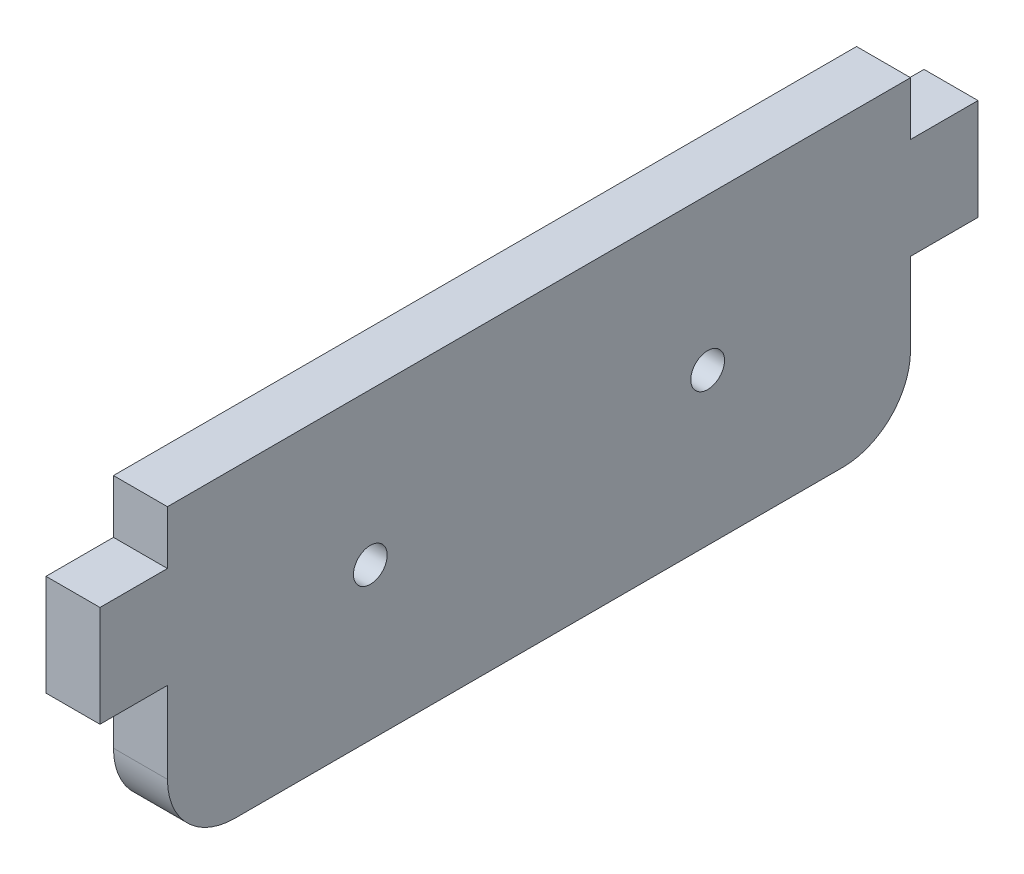
ISO-10303-21;
HEADER;
FILE_DESCRIPTION(('STEP AP214'),'2;1');
FILE_NAME('part.step','',(''),(''),'','','');
FILE_SCHEMA(('AUTOMOTIVE_DESIGN { 1 0 10303 214 1 1 1 1 }'));
ENDSEC;
DATA;
#1=APPLICATION_CONTEXT('core data for automotive mechanical design processes');
#2=APPLICATION_PROTOCOL_DEFINITION('international standard','automotive_design',2000,#1);
#3=PRODUCT_CONTEXT('',#1,'mechanical');
#4=PRODUCT('Part','Part','',(#3));
#5=PRODUCT_RELATED_PRODUCT_CATEGORY('part','',(#4));
#6=PRODUCT_DEFINITION_FORMATION('','',#4);
#7=PRODUCT_DEFINITION_CONTEXT('part definition',#1,'design');
#8=PRODUCT_DEFINITION('design','',#6,#7);
#9=PRODUCT_DEFINITION_SHAPE('','',#8);
#10=(LENGTH_UNIT() NAMED_UNIT(*) SI_UNIT(.MILLI.,.METRE.));
#11=(NAMED_UNIT(*) PLANE_ANGLE_UNIT() SI_UNIT($,.RADIAN.));
#12=(NAMED_UNIT(*) SI_UNIT($,.STERADIAN.) SOLID_ANGLE_UNIT());
#13=UNCERTAINTY_MEASURE_WITH_UNIT(LENGTH_MEASURE(1.E-05),#10,'distance_accuracy_value','');
#14=(GEOMETRIC_REPRESENTATION_CONTEXT(3) GLOBAL_UNCERTAINTY_ASSIGNED_CONTEXT((#13)) GLOBAL_UNIT_ASSIGNED_CONTEXT((#10,
#11,#12)) REPRESENTATION_CONTEXT('',''));
#15=CARTESIAN_POINT('',(0.,0.,0.));
#16=DIRECTION('',(0.,0.,1.));
#17=DIRECTION('',(1.,0.,0.));
#18=AXIS2_PLACEMENT_3D('',#15,#16,#17);
#19=CARTESIAN_POINT('',(-55.0000000000805,-1.82088380911604E-10,-120.14));
#20=DIRECTION('',(0.,0.,1.));
#21=DIRECTION('',(1.,0.,0.));
#22=AXIS2_PLACEMENT_3D('',#19,#20,#21);
#23=PLANE('',#22);
#24=DIRECTION('',(-1.,0.,0.));
#25=VECTOR('',#24,1.);
#26=CARTESIAN_POINT('',(-59.0000000000146,-70.5000000000152,-120.14));
#27=LINE('',#26,#25);
#28=CARTESIAN_POINT('',(-51.0000000000146,-70.5000000000152,-120.14));
#29=VERTEX_POINT('',#28);
#30=CARTESIAN_POINT('',(-59.0000000000146,-70.5000000000152,-120.14));
#31=VERTEX_POINT('',#30);
#32=EDGE_CURVE('E54',#29,#31,#27,.T.);
#33=ORIENTED_EDGE('',*,*,#32,.T.);
#34=DIRECTION('',(0.,-1.,0.));
#35=VECTOR('',#34,1.);
#36=CARTESIAN_POINT('',(-59.0000000000146,-62.5655810765651,-120.14));
#37=LINE('',#36,#35);
#38=CARTESIAN_POINT('',(-59.0000000000146,-62.5655810765651,-120.14));
#39=VERTEX_POINT('',#38);
#40=EDGE_CURVE('E146',#39,#31,#37,.T.);
#41=ORIENTED_EDGE('',*,*,#40,.F.);
#42=DIRECTION('',(-1.,0.,0.));
#43=VECTOR('',#42,1.);
#44=CARTESIAN_POINT('',(-51.0000000000146,-62.5655810765651,-120.14));
#45=LINE('',#44,#43);
#46=CARTESIAN_POINT('',(-51.0000000000146,-62.5655810765651,-120.14));
#47=VERTEX_POINT('',#46);
#48=EDGE_CURVE('E147',#47,#39,#45,.T.);
#49=ORIENTED_EDGE('',*,*,#48,.F.);
#50=DIRECTION('',(0.,1.,0.));
#51=VECTOR('',#50,1.);
#52=CARTESIAN_POINT('',(-51.0000000000146,-92.5655810765651,-120.14));
#53=LINE('',#52,#51);
#54=EDGE_CURVE('E59',#29,#47,#53,.T.);
#55=ORIENTED_EDGE('',*,*,#54,.F.);
#56=EDGE_LOOP('',(#33,#41,#49,#55));
#57=FACE_BOUND('',#56,.T.);
#58=ADVANCED_FACE('F37',(#57),#23,.F.);
#59=DIRECTION('',(1.,0.,0.));
#60=VECTOR('',#59,1.);
#61=CARTESIAN_POINT('',(-59.0000000000146,-85.5000000000152,-120.14));
#62=LINE('',#61,#60);
#63=CARTESIAN_POINT('',(-59.0000000000146,-85.5000000000152,-120.14));
#64=VERTEX_POINT('',#63);
#65=CARTESIAN_POINT('',(-51.0000000000146,-85.5000000000152,-120.14));
#66=VERTEX_POINT('',#65);
#67=EDGE_CURVE('E141',#64,#66,#62,.T.);
#68=ORIENTED_EDGE('',*,*,#67,.T.);
#69=CARTESIAN_POINT('',(-51.0000000000146,-97.5655810765651,-120.14));
#70=VERTEX_POINT('',#69);
#71=EDGE_CURVE('E184',#70,#66,#53,.T.);
#72=ORIENTED_EDGE('',*,*,#71,.F.);
#73=DIRECTION('',(1.,0.,0.));
#74=VECTOR('',#73,1.);
#75=CARTESIAN_POINT('',(-55.0000000000805,-97.5655810765651,-120.14));
#76=LINE('',#75,#74);
#77=CARTESIAN_POINT('',(-59.0000000000146,-97.5655810765651,-120.14));
#78=VERTEX_POINT('',#77);
#79=EDGE_CURVE('E11',#70,#78,#76,.F.);
#80=ORIENTED_EDGE('',*,*,#79,.T.);
#81=EDGE_CURVE('E136',#64,#78,#37,.T.);
#82=ORIENTED_EDGE('',*,*,#81,.F.);
#83=EDGE_LOOP('',(#68,#72,#80,#82));
#84=FACE_BOUND('',#83,.T.);
#85=ADVANCED_FACE('F138',(#84),#23,.F.);
#86=CARTESIAN_POINT('',(-51.0000000000146,-70.5000000000152,-10.));
#87=DIRECTION('',(1.,0.,0.));
#88=DIRECTION('',(0.,0.,-1.));
#89=AXIS2_PLACEMENT_3D('',#86,#87,#88);
#90=PLANE('',#89);
#91=CARTESIAN_POINT('',(-51.0000000000146,-85.0655810765651,-40.07));
#92=DIRECTION('',(1.,0.,0.));
#93=DIRECTION('',(0.,0.,-1.));
#94=AXIS2_PLACEMENT_3D('',#91,#92,#93);
#95=CIRCLE('',#94,2.5);
#96=CARTESIAN_POINT('',(-51.0000000000146,-85.0655810765651,-42.57));
#97=VERTEX_POINT('',#96);
#98=EDGE_CURVE('E249',#97,#97,#95,.T.);
#99=ORIENTED_EDGE('',*,*,#98,.F.);
#100=EDGE_LOOP('',(#99));
#101=FACE_BOUND('',#100,.T.);
#102=CARTESIAN_POINT('',(-51.0000000000146,-85.0655810765651,-90.07));
#103=DIRECTION('',(1.,0.,0.));
#104=DIRECTION('',(0.,0.,1.));
#105=AXIS2_PLACEMENT_3D('',#102,#103,#104);
#106=CIRCLE('',#105,2.5);
#107=CARTESIAN_POINT('',(-51.0000000000146,-85.0655810765651,-87.57));
#108=VERTEX_POINT('',#107);
#109=EDGE_CURVE('E169',#108,#108,#106,.T.);
#110=ORIENTED_EDGE('',*,*,#109,.F.);
#111=EDGE_LOOP('',(#110));
#112=FACE_BOUND('',#111,.T.);
#113=DIRECTION('',(0.,-1.,0.));
#114=VECTOR('',#113,1.);
#115=CARTESIAN_POINT('',(-51.0000000000146,-92.5655810765651,-10.));
#116=LINE('',#115,#114);
#117=CARTESIAN_POINT('',(-51.0000000000146,-85.5000000000152,-10.));
#118=VERTEX_POINT('',#117);
#119=CARTESIAN_POINT('',(-51.0000000000146,-97.5655810765651,-10.));
#120=VERTEX_POINT('',#119);
#121=EDGE_CURVE('E194',#118,#120,#116,.T.);
#122=ORIENTED_EDGE('',*,*,#121,.T.);
#123=CARTESIAN_POINT('',(-51.0000000000146,-97.5655810765651,-20.));
#124=DIRECTION('',(1.,0.,0.));
#125=DIRECTION('',(0.,0.,-1.));
#126=AXIS2_PLACEMENT_3D('',#123,#124,#125);
#127=CIRCLE('',#126,10.);
#128=CARTESIAN_POINT('',(-51.0000000000146,-107.565581076565,-20.));
#129=VERTEX_POINT('',#128);
#130=EDGE_CURVE('E46',#120,#129,#127,.T.);
#131=ORIENTED_EDGE('',*,*,#130,.T.);
#132=DIRECTION('',(0.,0.,1.));
#133=VECTOR('',#132,1.);
#134=CARTESIAN_POINT('',(-51.0000000000146,-107.565581076565,-165.845579528106));
#135=LINE('',#134,#133);
#136=CARTESIAN_POINT('',(-51.0000000000146,-107.565581076565,-110.14));
#137=VERTEX_POINT('',#136);
#138=EDGE_CURVE('E200',#137,#129,#135,.T.);
#139=ORIENTED_EDGE('',*,*,#138,.F.);
#140=CARTESIAN_POINT('',(-51.0000000000146,-97.5655810765651,-110.14));
#141=DIRECTION('',(1.,0.,0.));
#142=DIRECTION('',(0.,0.,-1.));
#143=AXIS2_PLACEMENT_3D('',#140,#141,#142);
#144=CIRCLE('',#143,10.);
#145=EDGE_CURVE('E245',#137,#70,#144,.T.);
#146=ORIENTED_EDGE('',*,*,#145,.T.);
#147=ORIENTED_EDGE('',*,*,#71,.T.);
#148=DIRECTION('',(0.,0.,-1.));
#149=VECTOR('',#148,1.);
#150=CARTESIAN_POINT('',(-51.0000000000146,-85.5000000000152,-120.14));
#151=LINE('',#150,#149);
#152=CARTESIAN_POINT('',(-51.0000000000146,-85.5000000000152,-130.14));
#153=VERTEX_POINT('',#152);
#154=EDGE_CURVE('E159',#66,#153,#151,.T.);
#155=ORIENTED_EDGE('',*,*,#154,.T.);
#156=DIRECTION('',(0.,1.,0.));
#157=VECTOR('',#156,1.);
#158=CARTESIAN_POINT('',(-51.0000000000146,-70.5000000000152,-130.14));
#159=LINE('',#158,#157);
#160=CARTESIAN_POINT('',(-51.0000000000146,-70.5000000000152,-130.14));
#161=VERTEX_POINT('',#160);
#162=EDGE_CURVE('E172',#153,#161,#159,.T.);
#163=ORIENTED_EDGE('',*,*,#162,.T.);
#164=DIRECTION('',(0.,0.,-1.));
#165=VECTOR('',#164,1.);
#166=CARTESIAN_POINT('',(-51.0000000000146,-70.5000000000152,-120.14));
#167=LINE('',#166,#165);
#168=EDGE_CURVE('E178',#29,#161,#167,.T.);
#169=ORIENTED_EDGE('',*,*,#168,.F.);
#170=ORIENTED_EDGE('',*,*,#54,.T.);
#171=DIRECTION('',(0.,0.,1.));
#172=VECTOR('',#171,1.);
#173=CARTESIAN_POINT('',(-51.0000000000146,-62.5655810765651,-165.845579528106));
#174=LINE('',#173,#172);
#175=CARTESIAN_POINT('',(-51.0000000000146,-62.5655810765651,-10.));
#176=VERTEX_POINT('',#175);
#177=EDGE_CURVE('E203',#47,#176,#174,.T.);
#178=ORIENTED_EDGE('',*,*,#177,.T.);
#179=CARTESIAN_POINT('',(-51.0000000000146,-70.5000000000152,-10.));
#180=VERTEX_POINT('',#179);
#181=EDGE_CURVE('E195',#176,#180,#116,.T.);
#182=ORIENTED_EDGE('',*,*,#181,.T.);
#183=DIRECTION('',(0.,0.,1.));
#184=VECTOR('',#183,1.);
#185=CARTESIAN_POINT('',(-51.0000000000146,-70.5000000000152,-10.));
#186=LINE('',#185,#184);
#187=CARTESIAN_POINT('',(-51.0000000000146,-70.5000000000152,0.));
#188=VERTEX_POINT('',#187);
#189=EDGE_CURVE('E215',#180,#188,#186,.T.);
#190=ORIENTED_EDGE('',*,*,#189,.T.);
#191=DIRECTION('',(0.,1.,0.));
#192=VECTOR('',#191,1.);
#193=CARTESIAN_POINT('',(-51.0000000000146,-70.5000000000152,0.));
#194=LINE('',#193,#192);
#195=CARTESIAN_POINT('',(-51.0000000000146,-85.5000000000152,0.));
#196=VERTEX_POINT('',#195);
#197=EDGE_CURVE('E188',#196,#188,#194,.T.);
#198=ORIENTED_EDGE('',*,*,#197,.F.);
#199=DIRECTION('',(0.,0.,1.));
#200=VECTOR('',#199,1.);
#201=CARTESIAN_POINT('',(-51.0000000000146,-85.5000000000152,-10.));
#202=LINE('',#201,#200);
#203=EDGE_CURVE('E226',#118,#196,#202,.T.);
#204=ORIENTED_EDGE('',*,*,#203,.F.);
#205=EDGE_LOOP('',(#122,#131,#139,#146,#147,#155,#163,#169,#170,#178,#182,#190,#198,#204));
#206=FACE_BOUND('',#205,.T.);
#207=ADVANCED_FACE('F261',(#101,#112,#206),#90,.T.);
#208=CARTESIAN_POINT('',(-59.0000000000146,-85.5000000000152,-10.));
#209=DIRECTION('',(0.,-1.,0.));
#210=DIRECTION('',(0.,0.,-1.));
#211=AXIS2_PLACEMENT_3D('',#208,#209,#210);
#212=PLANE('',#211);
#213=DIRECTION('',(1.,0.,0.));
#214=VECTOR('',#213,1.);
#215=CARTESIAN_POINT('',(-59.0000000000146,-85.5000000000152,0.));
#216=LINE('',#215,#214);
#217=CARTESIAN_POINT('',(-59.0000000000146,-85.5000000000152,0.));
#218=VERTEX_POINT('',#217);
#219=EDGE_CURVE('E212',#218,#196,#216,.T.);
#220=ORIENTED_EDGE('',*,*,#219,.F.);
#221=DIRECTION('',(0.,0.,1.));
#222=VECTOR('',#221,1.);
#223=CARTESIAN_POINT('',(-59.0000000000146,-85.5000000000152,-10.));
#224=LINE('',#223,#222);
#225=CARTESIAN_POINT('',(-59.0000000000146,-85.5000000000152,-10.));
#226=VERTEX_POINT('',#225);
#227=EDGE_CURVE('E229',#226,#218,#224,.T.);
#228=ORIENTED_EDGE('',*,*,#227,.F.);
#229=DIRECTION('',(1.,0.,0.));
#230=VECTOR('',#229,1.);
#231=CARTESIAN_POINT('',(-59.0000000000146,-85.5000000000152,-10.));
#232=LINE('',#231,#230);
#233=EDGE_CURVE('E211',#226,#118,#232,.T.);
#234=ORIENTED_EDGE('',*,*,#233,.T.);
#235=ORIENTED_EDGE('',*,*,#203,.T.);
#236=EDGE_LOOP('',(#220,#228,#234,#235));
#237=FACE_BOUND('',#236,.T.);
#238=ADVANCED_FACE('F264',(#237),#212,.T.);
#239=CARTESIAN_POINT('',(-59.0000000000146,-70.5000000000152,-10.));
#240=DIRECTION('',(-1.,0.,0.));
#241=DIRECTION('',(0.,0.,1.));
#242=AXIS2_PLACEMENT_3D('',#239,#240,#241);
#243=PLANE('',#242);
#244=CARTESIAN_POINT('',(-59.0000000000146,-85.0655810765651,-40.07));
#245=DIRECTION('',(-1.,0.,0.));
#246=DIRECTION('',(0.,0.,1.));
#247=AXIS2_PLACEMENT_3D('',#244,#245,#246);
#248=CIRCLE('',#247,2.5);
#249=CARTESIAN_POINT('',(-59.0000000000146,-85.0655810765651,-37.57));
#250=VERTEX_POINT('',#249);
#251=EDGE_CURVE('E41',#250,#250,#248,.T.);
#252=ORIENTED_EDGE('',*,*,#251,.F.);
#253=EDGE_LOOP('',(#252));
#254=FACE_BOUND('',#253,.T.);
#255=CARTESIAN_POINT('',(-59.0000000000146,-85.0655810765651,-90.07));
#256=DIRECTION('',(-1.,0.,0.));
#257=DIRECTION('',(0.,0.,1.));
#258=AXIS2_PLACEMENT_3D('',#255,#256,#257);
#259=CIRCLE('',#258,2.5);
#260=CARTESIAN_POINT('',(-59.0000000000146,-85.0655810765651,-87.57));
#261=VERTEX_POINT('',#260);
#262=EDGE_CURVE('E247',#261,#261,#259,.T.);
#263=ORIENTED_EDGE('',*,*,#262,.F.);
#264=EDGE_LOOP('',(#263));
#265=FACE_BOUND('',#264,.T.);
#266=DIRECTION('',(0.,0.,1.));
#267=VECTOR('',#266,1.);
#268=CARTESIAN_POINT('',(-59.0000000000146,-107.565581076565,-165.845579528106));
#269=LINE('',#268,#267);
#270=CARTESIAN_POINT('',(-59.0000000000146,-107.565581076565,-110.14));
#271=VERTEX_POINT('',#270);
#272=CARTESIAN_POINT('',(-59.0000000000146,-107.565581076565,-20.));
#273=VERTEX_POINT('',#272);
#274=EDGE_CURVE('E198',#271,#273,#269,.T.);
#275=ORIENTED_EDGE('',*,*,#274,.T.);
#276=CARTESIAN_POINT('',(-59.0000000000146,-97.5655810765651,-20.));
#277=DIRECTION('',(-1.,0.,0.));
#278=DIRECTION('',(0.,0.,1.));
#279=AXIS2_PLACEMENT_3D('',#276,#277,#278);
#280=CIRCLE('',#279,10.);
#281=CARTESIAN_POINT('',(-59.0000000000146,-97.5655810765651,-10.));
#282=VERTEX_POINT('',#281);
#283=EDGE_CURVE('E241',#273,#282,#280,.T.);
#284=ORIENTED_EDGE('',*,*,#283,.T.);
#285=DIRECTION('',(0.,1.,0.));
#286=VECTOR('',#285,1.);
#287=CARTESIAN_POINT('',(-59.0000000000146,-62.5655810765651,-10.));
#288=LINE('',#287,#286);
#289=EDGE_CURVE('E189',#282,#226,#288,.T.);
#290=ORIENTED_EDGE('',*,*,#289,.T.);
#291=ORIENTED_EDGE('',*,*,#227,.T.);
#292=DIRECTION('',(0.,-1.,0.));
#293=VECTOR('',#292,1.);
#294=CARTESIAN_POINT('',(-59.0000000000146,-70.5000000000152,0.));
#295=LINE('',#294,#293);
#296=CARTESIAN_POINT('',(-59.0000000000146,-70.5000000000152,0.));
#297=VERTEX_POINT('',#296);
#298=EDGE_CURVE('E221',#297,#218,#295,.T.);
#299=ORIENTED_EDGE('',*,*,#298,.F.);
#300=DIRECTION('',(0.,0.,1.));
#301=VECTOR('',#300,1.);
#302=CARTESIAN_POINT('',(-59.0000000000146,-70.5000000000152,-10.));
#303=LINE('',#302,#301);
#304=CARTESIAN_POINT('',(-59.0000000000146,-70.5000000000152,-10.));
#305=VERTEX_POINT('',#304);
#306=EDGE_CURVE('E231',#305,#297,#303,.T.);
#307=ORIENTED_EDGE('',*,*,#306,.F.);
#308=CARTESIAN_POINT('',(-59.0000000000146,-62.5655810765651,-10.));
#309=VERTEX_POINT('',#308);
#310=EDGE_CURVE('E181',#305,#309,#288,.T.);
#311=ORIENTED_EDGE('',*,*,#310,.T.);
#312=DIRECTION('',(0.,0.,1.));
#313=VECTOR('',#312,1.);
#314=CARTESIAN_POINT('',(-59.0000000000146,-62.5655810765651,-165.845579528106));
#315=LINE('',#314,#313);
#316=EDGE_CURVE('E205',#39,#309,#315,.T.);
#317=ORIENTED_EDGE('',*,*,#316,.F.);
#318=ORIENTED_EDGE('',*,*,#40,.T.);
#319=DIRECTION('',(0.,0.,-1.));
#320=VECTOR('',#319,1.);
#321=CARTESIAN_POINT('',(-59.0000000000146,-70.5000000000152,-120.14));
#322=LINE('',#321,#320);
#323=CARTESIAN_POINT('',(-59.0000000000146,-70.5000000000152,-130.14));
#324=VERTEX_POINT('',#323);
#325=EDGE_CURVE('E158',#31,#324,#322,.T.);
#326=ORIENTED_EDGE('',*,*,#325,.T.);
#327=DIRECTION('',(0.,-1.,0.));
#328=VECTOR('',#327,1.);
#329=CARTESIAN_POINT('',(-59.0000000000146,-70.5000000000152,-130.14));
#330=LINE('',#329,#328);
#331=CARTESIAN_POINT('',(-59.0000000000146,-85.5000000000152,-130.14));
#332=VERTEX_POINT('',#331);
#333=EDGE_CURVE('E155',#324,#332,#330,.T.);
#334=ORIENTED_EDGE('',*,*,#333,.T.);
#335=DIRECTION('',(0.,0.,-1.));
#336=VECTOR('',#335,1.);
#337=CARTESIAN_POINT('',(-59.0000000000146,-85.5000000000152,-120.14));
#338=LINE('',#337,#336);
#339=EDGE_CURVE('E150',#64,#332,#338,.T.);
#340=ORIENTED_EDGE('',*,*,#339,.F.);
#341=ORIENTED_EDGE('',*,*,#81,.T.);
#342=CARTESIAN_POINT('',(-59.0000000000146,-97.5655810765651,-110.14));
#343=DIRECTION('',(-1.,0.,0.));
#344=DIRECTION('',(0.,0.,1.));
#345=AXIS2_PLACEMENT_3D('',#342,#343,#344);
#346=CIRCLE('',#345,10.);
#347=EDGE_CURVE('E239',#78,#271,#346,.T.);
#348=ORIENTED_EDGE('',*,*,#347,.T.);
#349=EDGE_LOOP('',(#275,#284,#290,#291,#299,#307,#311,#317,#318,#326,#334,#340,#341,#348));
#350=FACE_BOUND('',#349,.T.);
#351=ADVANCED_FACE('F152',(#254,#265,#350),#243,.T.);
#352=CARTESIAN_POINT('',(-59.0000000000146,-70.5000000000152,-10.));
#353=DIRECTION('',(0.,1.,0.));
#354=DIRECTION('',(0.,0.,1.));
#355=AXIS2_PLACEMENT_3D('',#352,#353,#354);
#356=PLANE('',#355);
#357=DIRECTION('',(-1.,0.,0.));
#358=VECTOR('',#357,1.);
#359=CARTESIAN_POINT('',(-59.0000000000146,-70.5000000000152,0.));
#360=LINE('',#359,#358);
#361=EDGE_CURVE('E218',#188,#297,#360,.T.);
#362=ORIENTED_EDGE('',*,*,#361,.F.);
#363=ORIENTED_EDGE('',*,*,#189,.F.);
#364=DIRECTION('',(-1.,0.,0.));
#365=VECTOR('',#364,1.);
#366=CARTESIAN_POINT('',(-59.0000000000146,-70.5000000000152,-10.));
#367=LINE('',#366,#365);
#368=EDGE_CURVE('E208',#180,#305,#367,.T.);
#369=ORIENTED_EDGE('',*,*,#368,.T.);
#370=ORIENTED_EDGE('',*,*,#306,.T.);
#371=EDGE_LOOP('',(#362,#363,#369,#370));
#372=FACE_BOUND('',#371,.T.);
#373=ADVANCED_FACE('F303',(#372),#356,.T.);
#374=CARTESIAN_POINT('',(0.,0.,0.));
#375=DIRECTION('',(0.,0.,1.));
#376=DIRECTION('',(1.,0.,0.));
#377=AXIS2_PLACEMENT_3D('',#374,#375,#376);
#378=PLANE('',#377);
#379=ORIENTED_EDGE('',*,*,#197,.T.);
#380=ORIENTED_EDGE('',*,*,#361,.T.);
#381=ORIENTED_EDGE('',*,*,#298,.T.);
#382=ORIENTED_EDGE('',*,*,#219,.T.);
#383=EDGE_LOOP('',(#379,#380,#381,#382));
#384=FACE_BOUND('',#383,.T.);
#385=ADVANCED_FACE('F306',(#384),#378,.T.);
#386=CARTESIAN_POINT('',(0.,0.,-10.));
#387=DIRECTION('',(0.,0.,-1.));
#388=DIRECTION('',(-1.,0.,0.));
#389=AXIS2_PLACEMENT_3D('',#386,#387,#388);
#390=PLANE('',#389);
#391=ORIENTED_EDGE('',*,*,#289,.F.);
#392=DIRECTION('',(-1.,0.,0.));
#393=VECTOR('',#392,1.);
#394=CARTESIAN_POINT('',(0.,-97.5655810765651,-10.));
#395=LINE('',#394,#393);
#396=EDGE_CURVE('E243',#282,#120,#395,.F.);
#397=ORIENTED_EDGE('',*,*,#396,.T.);
#398=ORIENTED_EDGE('',*,*,#121,.F.);
#399=ORIENTED_EDGE('',*,*,#233,.F.);
#400=EDGE_LOOP('',(#391,#397,#398,#399));
#401=FACE_BOUND('',#400,.T.);
#402=ADVANCED_FACE('F310',(#401),#390,.F.);
#403=ORIENTED_EDGE('',*,*,#368,.F.);
#404=ORIENTED_EDGE('',*,*,#181,.F.);
#405=DIRECTION('',(1.,0.,0.));
#406=VECTOR('',#405,1.);
#407=CARTESIAN_POINT('',(-51.0000000000146,-62.5655810765651,-10.));
#408=LINE('',#407,#406);
#409=EDGE_CURVE('E191',#309,#176,#408,.T.);
#410=ORIENTED_EDGE('',*,*,#409,.F.);
#411=ORIENTED_EDGE('',*,*,#310,.F.);
#412=EDGE_LOOP('',(#403,#404,#410,#411));
#413=FACE_BOUND('',#412,.T.);
#414=ADVANCED_FACE('F298',(#413),#390,.F.);
#415=CARTESIAN_POINT('',(-51.0000000000146,-107.565581076565,-165.845579528106));
#416=DIRECTION('',(0.,1.,0.));
#417=DIRECTION('',(0.,0.,1.));
#418=AXIS2_PLACEMENT_3D('',#415,#416,#417);
#419=PLANE('',#418);
#420=ORIENTED_EDGE('',*,*,#138,.T.);
#421=DIRECTION('',(-1.,0.,0.));
#422=VECTOR('',#421,1.);
#423=CARTESIAN_POINT('',(-51.0000000000146,-107.565581076565,-20.));
#424=LINE('',#423,#422);
#425=EDGE_CURVE('E236',#129,#273,#424,.T.);
#426=ORIENTED_EDGE('',*,*,#425,.T.);
#427=ORIENTED_EDGE('',*,*,#274,.F.);
#428=DIRECTION('',(1.,0.,0.));
#429=VECTOR('',#428,1.);
#430=CARTESIAN_POINT('',(-51.0000000000146,-107.565581076565,-110.14));
#431=LINE('',#430,#429);
#432=EDGE_CURVE('E228',#271,#137,#431,.T.);
#433=ORIENTED_EDGE('',*,*,#432,.T.);
#434=EDGE_LOOP('',(#420,#426,#427,#433));
#435=FACE_BOUND('',#434,.T.);
#436=ADVANCED_FACE('F280',(#435),#419,.F.);
#437=CARTESIAN_POINT('',(-51.0000000000146,-62.5655810765651,-165.845579528106));
#438=DIRECTION('',(0.,-1.,0.));
#439=DIRECTION('',(0.,0.,-1.));
#440=AXIS2_PLACEMENT_3D('',#437,#438,#439);
#441=PLANE('',#440);
#442=ORIENTED_EDGE('',*,*,#177,.F.);
#443=ORIENTED_EDGE('',*,*,#48,.T.);
#444=ORIENTED_EDGE('',*,*,#316,.T.);
#445=ORIENTED_EDGE('',*,*,#409,.T.);
#446=EDGE_LOOP('',(#442,#443,#444,#445));
#447=FACE_BOUND('',#446,.T.);
#448=ADVANCED_FACE('F295',(#447),#441,.F.);
#449=CARTESIAN_POINT('',(-51.0000000000146,-97.5655810765651,-20.));
#450=DIRECTION('',(-1.,0.,0.));
#451=DIRECTION('',(0.,0.,1.));
#452=AXIS2_PLACEMENT_3D('',#449,#450,#451);
#453=CYLINDRICAL_SURFACE('',#452,10.);
#454=ORIENTED_EDGE('',*,*,#130,.F.);
#455=ORIENTED_EDGE('',*,*,#396,.F.);
#456=ORIENTED_EDGE('',*,*,#283,.F.);
#457=ORIENTED_EDGE('',*,*,#425,.F.);
#458=EDGE_LOOP('',(#454,#455,#456,#457));
#459=FACE_BOUND('',#458,.T.);
#460=ADVANCED_FACE('F277',(#459),#453,.T.);
#461=CARTESIAN_POINT('',(-51.0000000000146,-97.5655810765651,-110.14));
#462=DIRECTION('',(1.,0.,0.));
#463=DIRECTION('',(0.,0.,-1.));
#464=AXIS2_PLACEMENT_3D('',#461,#462,#463);
#465=CYLINDRICAL_SURFACE('',#464,10.);
#466=ORIENTED_EDGE('',*,*,#347,.F.);
#467=ORIENTED_EDGE('',*,*,#79,.F.);
#468=ORIENTED_EDGE('',*,*,#145,.F.);
#469=ORIENTED_EDGE('',*,*,#432,.F.);
#470=EDGE_LOOP('',(#466,#467,#468,#469));
#471=FACE_BOUND('',#470,.T.);
#472=ADVANCED_FACE('F39',(#471),#465,.T.);
#473=CARTESIAN_POINT('',(-59.0000000000146,-70.5000000000152,-120.14));
#474=DIRECTION('',(0.,-1.,0.));
#475=DIRECTION('',(0.,0.,-1.));
#476=AXIS2_PLACEMENT_3D('',#473,#474,#475);
#477=PLANE('',#476);
#478=DIRECTION('',(-1.,0.,0.));
#479=VECTOR('',#478,1.);
#480=CARTESIAN_POINT('',(-59.0000000000146,-70.5000000000152,-130.14));
#481=LINE('',#480,#479);
#482=EDGE_CURVE('E164',#161,#324,#481,.T.);
#483=ORIENTED_EDGE('',*,*,#482,.T.);
#484=ORIENTED_EDGE('',*,*,#325,.F.);
#485=ORIENTED_EDGE('',*,*,#32,.F.);
#486=ORIENTED_EDGE('',*,*,#168,.T.);
#487=EDGE_LOOP('',(#483,#484,#485,#486));
#488=FACE_BOUND('',#487,.T.);
#489=ADVANCED_FACE('F290',(#488),#477,.F.);
#490=CARTESIAN_POINT('',(-59.0000000000146,-85.5000000000152,-120.14));
#491=DIRECTION('',(0.,1.,0.));
#492=DIRECTION('',(0.,0.,1.));
#493=AXIS2_PLACEMENT_3D('',#490,#491,#492);
#494=PLANE('',#493);
#495=DIRECTION('',(1.,0.,0.));
#496=VECTOR('',#495,1.);
#497=CARTESIAN_POINT('',(-59.0000000000146,-85.5000000000152,-130.14));
#498=LINE('',#497,#496);
#499=EDGE_CURVE('E175',#332,#153,#498,.T.);
#500=ORIENTED_EDGE('',*,*,#499,.T.);
#501=ORIENTED_EDGE('',*,*,#154,.F.);
#502=ORIENTED_EDGE('',*,*,#67,.F.);
#503=ORIENTED_EDGE('',*,*,#339,.T.);
#504=EDGE_LOOP('',(#500,#501,#502,#503));
#505=FACE_BOUND('',#504,.T.);
#506=ADVANCED_FACE('F162',(#505),#494,.F.);
#507=CARTESIAN_POINT('',(0.,0.,-130.14));
#508=DIRECTION('',(0.,0.,-1.));
#509=DIRECTION('',(1.,0.,0.));
#510=AXIS2_PLACEMENT_3D('',#507,#508,#509);
#511=PLANE('',#510);
#512=ORIENTED_EDGE('',*,*,#162,.F.);
#513=ORIENTED_EDGE('',*,*,#499,.F.);
#514=ORIENTED_EDGE('',*,*,#333,.F.);
#515=ORIENTED_EDGE('',*,*,#482,.F.);
#516=EDGE_LOOP('',(#512,#513,#514,#515));
#517=FACE_BOUND('',#516,.T.);
#518=ADVANCED_FACE('F287',(#517),#511,.T.);
#519=CARTESIAN_POINT('',(-61.0000000000146,-85.0655810765651,-90.07));
#520=DIRECTION('',(1.,0.,0.));
#521=DIRECTION('',(0.,0.,-1.));
#522=AXIS2_PLACEMENT_3D('',#519,#520,#521);
#523=CYLINDRICAL_SURFACE('',#522,2.5);
#524=ORIENTED_EDGE('',*,*,#262,.T.);
#525=EDGE_LOOP('',(#524));
#526=FACE_BOUND('',#525,.T.);
#527=ORIENTED_EDGE('',*,*,#109,.T.);
#528=EDGE_LOOP('',(#527));
#529=FACE_BOUND('',#528,.T.);
#530=ADVANCED_FACE('F259',(#526,#529),#523,.F.);
#531=CARTESIAN_POINT('',(-61.0000000000146,-85.0655810765651,-40.07));
#532=DIRECTION('',(1.,0.,0.));
#533=DIRECTION('',(0.,0.,-1.));
#534=AXIS2_PLACEMENT_3D('',#531,#532,#533);
#535=CYLINDRICAL_SURFACE('',#534,2.5);
#536=ORIENTED_EDGE('',*,*,#251,.T.);
#537=EDGE_LOOP('',(#536));
#538=FACE_BOUND('',#537,.T.);
#539=ORIENTED_EDGE('',*,*,#98,.T.);
#540=EDGE_LOOP('',(#539));
#541=FACE_BOUND('',#540,.T.);
#542=ADVANCED_FACE('F333',(#538,#541),#535,.F.);
#543=CLOSED_SHELL('',(#58,#85,#207,#238,#351,#373,#385,#402,#414,#436,#448,#460,#472,#489,#506,
#518,#530,#542));
#544=MANIFOLD_SOLID_BREP('B2',#543);
#545=ADVANCED_BREP_SHAPE_REPRESENTATION('',(#18,#544),#14);
#546=SHAPE_DEFINITION_REPRESENTATION(#9,#545);
ENDSEC;
END-ISO-10303-21;
